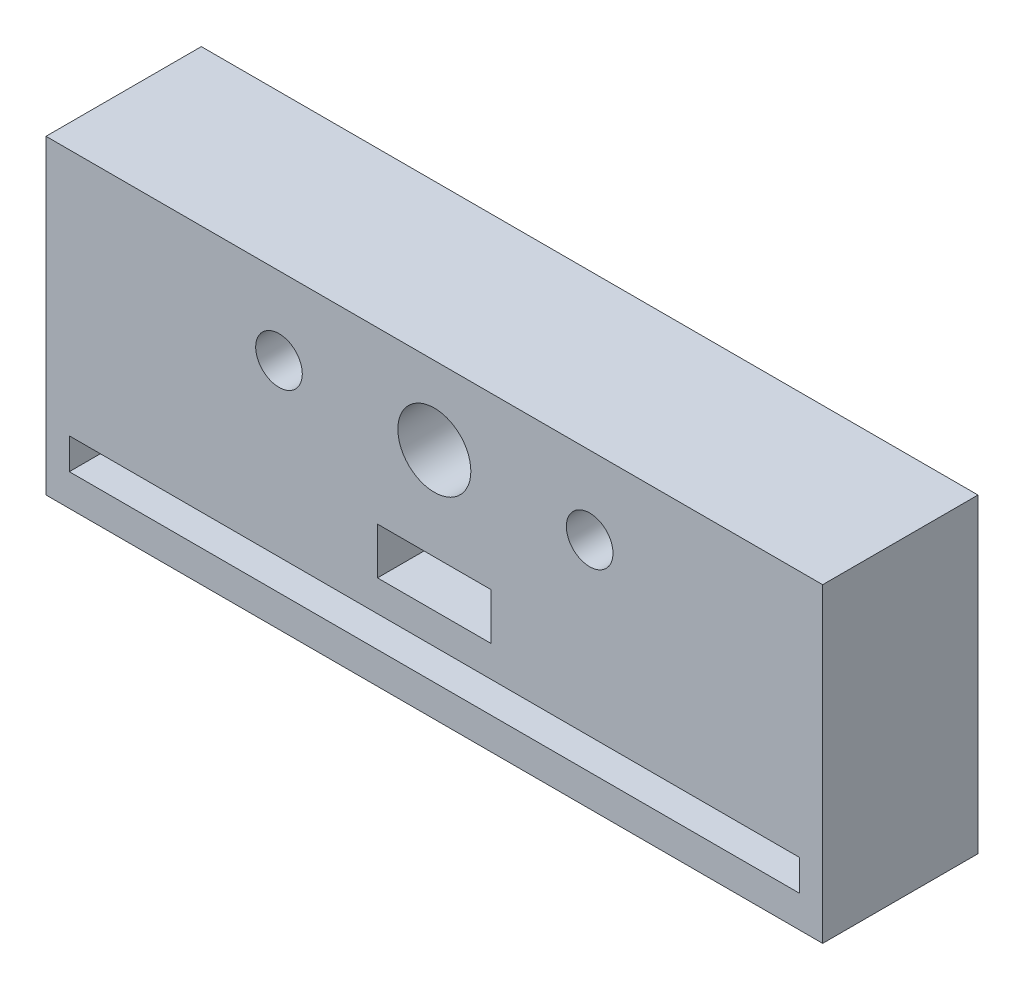
ISO-10303-21;
HEADER;
FILE_DESCRIPTION(('STEP AP214'),'2;1');
FILE_NAME('part.step','',(''),(''),'','','');
FILE_SCHEMA(('AUTOMOTIVE_DESIGN { 1 0 10303 214 1 1 1 1 }'));
ENDSEC;
DATA;
#1=APPLICATION_CONTEXT('core data for automotive mechanical design processes');
#2=APPLICATION_PROTOCOL_DEFINITION('international standard','automotive_design',2000,#1);
#3=PRODUCT_CONTEXT('',#1,'mechanical');
#4=PRODUCT('Part','Part','',(#3));
#5=PRODUCT_RELATED_PRODUCT_CATEGORY('part','',(#4));
#6=PRODUCT_DEFINITION_FORMATION('','',#4);
#7=PRODUCT_DEFINITION_CONTEXT('part definition',#1,'design');
#8=PRODUCT_DEFINITION('design','',#6,#7);
#9=PRODUCT_DEFINITION_SHAPE('','',#8);
#10=(LENGTH_UNIT() NAMED_UNIT(*) SI_UNIT(.MILLI.,.METRE.));
#11=(NAMED_UNIT(*) PLANE_ANGLE_UNIT() SI_UNIT($,.RADIAN.));
#12=(NAMED_UNIT(*) SI_UNIT($,.STERADIAN.) SOLID_ANGLE_UNIT());
#13=UNCERTAINTY_MEASURE_WITH_UNIT(LENGTH_MEASURE(1.E-05),#10,'distance_accuracy_value','');
#14=(GEOMETRIC_REPRESENTATION_CONTEXT(3) GLOBAL_UNCERTAINTY_ASSIGNED_CONTEXT((#13)) GLOBAL_UNIT_ASSIGNED_CONTEXT((#10,
#11,#12)) REPRESENTATION_CONTEXT('',''));
#15=CARTESIAN_POINT('',(0.,0.,0.));
#16=DIRECTION('',(0.,0.,1.));
#17=DIRECTION('',(1.,0.,0.));
#18=AXIS2_PLACEMENT_3D('',#15,#16,#17);
#19=CARTESIAN_POINT('',(0.,0.,10.));
#20=DIRECTION('',(0.,0.,-1.));
#21=DIRECTION('',(-1.,0.,0.));
#22=AXIS2_PLACEMENT_3D('',#19,#20,#21);
#23=PLANE('',#22);
#24=CARTESIAN_POINT('',(10.,7.45071428571426,10.));
#25=DIRECTION('',(0.,0.,1.));
#26=DIRECTION('',(1.,0.,0.));
#27=AXIS2_PLACEMENT_3D('',#24,#25,#26);
#28=CIRCLE('',#27,1.5);
#29=CARTESIAN_POINT('',(11.5,7.45071428571426,10.));
#30=VERTEX_POINT('',#29);
#31=EDGE_CURVE('E161',#30,#30,#28,.T.);
#32=ORIENTED_EDGE('',*,*,#31,.F.);
#33=EDGE_LOOP('',(#32));
#34=FACE_BOUND('',#33,.T.);
#35=CARTESIAN_POINT('',(-10.,7.45071428571426,10.));
#36=DIRECTION('',(0.,0.,1.));
#37=DIRECTION('',(1.,0.,0.));
#38=AXIS2_PLACEMENT_3D('',#35,#36,#37);
#39=CIRCLE('',#38,1.5);
#40=CARTESIAN_POINT('',(-8.5,7.45071428571426,10.));
#41=VERTEX_POINT('',#40);
#42=EDGE_CURVE('E167',#41,#41,#39,.T.);
#43=ORIENTED_EDGE('',*,*,#42,.F.);
#44=EDGE_LOOP('',(#43));
#45=FACE_BOUND('',#44,.T.);
#46=DIRECTION('',(0.,1.,0.));
#47=VECTOR('',#46,1.);
#48=CARTESIAN_POINT('',(3.66,1.5,10.));
#49=LINE('',#48,#47);
#50=CARTESIAN_POINT('',(3.66,-1.5,10.));
#51=VERTEX_POINT('',#50);
#52=CARTESIAN_POINT('',(3.66,1.5,10.));
#53=VERTEX_POINT('',#52);
#54=EDGE_CURVE('E173',#51,#53,#49,.T.);
#55=ORIENTED_EDGE('',*,*,#54,.F.);
#56=DIRECTION('',(1.,0.,0.));
#57=VECTOR('',#56,1.);
#58=CARTESIAN_POINT('',(-3.66,-1.5,10.));
#59=LINE('',#58,#57);
#60=CARTESIAN_POINT('',(-3.66,-1.5,10.));
#61=VERTEX_POINT('',#60);
#62=EDGE_CURVE('E181',#61,#51,#59,.T.);
#63=ORIENTED_EDGE('',*,*,#62,.F.);
#64=DIRECTION('',(0.,-1.,0.));
#65=VECTOR('',#64,1.);
#66=CARTESIAN_POINT('',(-3.66,1.5,10.));
#67=LINE('',#66,#65);
#68=CARTESIAN_POINT('',(-3.66,1.5,10.));
#69=VERTEX_POINT('',#68);
#70=EDGE_CURVE('E178',#69,#61,#67,.T.);
#71=ORIENTED_EDGE('',*,*,#70,.F.);
#72=DIRECTION('',(-1.,0.,0.));
#73=VECTOR('',#72,1.);
#74=CARTESIAN_POINT('',(-3.66,1.5,10.));
#75=LINE('',#74,#73);
#76=EDGE_CURVE('E175',#53,#69,#75,.T.);
#77=ORIENTED_EDGE('',*,*,#76,.F.);
#78=EDGE_LOOP('',(#55,#63,#71,#77));
#79=FACE_BOUND('',#78,.T.);
#80=DIRECTION('',(0.,-1.,0.));
#81=VECTOR('',#80,1.);
#82=CARTESIAN_POINT('',(-25.,-7.54928571428574,10.));
#83=LINE('',#82,#81);
#84=CARTESIAN_POINT('',(-25.,12.4507142857143,10.));
#85=VERTEX_POINT('',#84);
#86=CARTESIAN_POINT('',(-25.,-7.54928571428574,10.));
#87=VERTEX_POINT('',#86);
#88=EDGE_CURVE('E204',#85,#87,#83,.T.);
#89=ORIENTED_EDGE('',*,*,#88,.T.);
#90=DIRECTION('',(1.,0.,0.));
#91=VECTOR('',#90,1.);
#92=CARTESIAN_POINT('',(-25.,-7.54928571428574,10.));
#93=LINE('',#92,#91);
#94=CARTESIAN_POINT('',(25.,-7.54928571428574,10.));
#95=VERTEX_POINT('',#94);
#96=EDGE_CURVE('E207',#87,#95,#93,.T.);
#97=ORIENTED_EDGE('',*,*,#96,.T.);
#98=DIRECTION('',(0.,1.,0.));
#99=VECTOR('',#98,1.);
#100=CARTESIAN_POINT('',(25.,-7.54928571428574,10.));
#101=LINE('',#100,#99);
#102=CARTESIAN_POINT('',(25.,12.4507142857143,10.));
#103=VERTEX_POINT('',#102);
#104=EDGE_CURVE('E210',#95,#103,#101,.T.);
#105=ORIENTED_EDGE('',*,*,#104,.T.);
#106=DIRECTION('',(-1.,0.,0.));
#107=VECTOR('',#106,1.);
#108=CARTESIAN_POINT('',(-25.,12.4507142857143,10.));
#109=LINE('',#108,#107);
#110=EDGE_CURVE('E212',#103,#85,#109,.T.);
#111=ORIENTED_EDGE('',*,*,#110,.T.);
#112=EDGE_LOOP('',(#89,#97,#105,#111));
#113=FACE_BOUND('',#112,.T.);
#114=DIRECTION('',(0.,-1.,0.));
#115=VECTOR('',#114,1.);
#116=CARTESIAN_POINT('',(-23.5,-3.5,10.));
#117=LINE('',#116,#115);
#118=CARTESIAN_POINT('',(-23.5,-3.5,10.));
#119=VERTEX_POINT('',#118);
#120=CARTESIAN_POINT('',(-23.5,-5.5,10.));
#121=VERTEX_POINT('',#120);
#122=EDGE_CURVE('E122',#119,#121,#117,.T.);
#123=ORIENTED_EDGE('',*,*,#122,.F.);
#124=DIRECTION('',(-1.,0.,0.));
#125=VECTOR('',#124,1.);
#126=CARTESIAN_POINT('',(-23.5,-3.5,10.));
#127=LINE('',#126,#125);
#128=CARTESIAN_POINT('',(23.5,-3.5,10.));
#129=VERTEX_POINT('',#128);
#130=EDGE_CURVE('E145',#129,#119,#127,.T.);
#131=ORIENTED_EDGE('',*,*,#130,.F.);
#132=DIRECTION('',(0.,1.,0.));
#133=VECTOR('',#132,1.);
#134=CARTESIAN_POINT('',(23.5,-3.5,10.));
#135=LINE('',#134,#133);
#136=CARTESIAN_POINT('',(23.5,-5.5,10.));
#137=VERTEX_POINT('',#136);
#138=EDGE_CURVE('E143',#137,#129,#135,.T.);
#139=ORIENTED_EDGE('',*,*,#138,.F.);
#140=DIRECTION('',(1.,0.,0.));
#141=VECTOR('',#140,1.);
#142=CARTESIAN_POINT('',(-23.5,-5.5,10.));
#143=LINE('',#142,#141);
#144=EDGE_CURVE('E130',#121,#137,#143,.T.);
#145=ORIENTED_EDGE('',*,*,#144,.F.);
#146=EDGE_LOOP('',(#123,#131,#139,#145));
#147=FACE_BOUND('',#146,.T.);
#148=CARTESIAN_POINT('',(0.,7.45071428571426,10.));
#149=DIRECTION('',(0.,0.,1.));
#150=DIRECTION('',(1.,0.,0.));
#151=AXIS2_PLACEMENT_3D('',#148,#149,#150);
#152=CIRCLE('',#151,2.35);
#153=CARTESIAN_POINT('',(2.35,7.45071428571426,10.));
#154=VERTEX_POINT('',#153);
#155=EDGE_CURVE('E151',#154,#154,#152,.T.);
#156=ORIENTED_EDGE('',*,*,#155,.F.);
#157=EDGE_LOOP('',(#156));
#158=FACE_BOUND('',#157,.T.);
#159=ADVANCED_FACE('F33',(#34,#45,#79,#113,#147,#158),#23,.F.);
#160=CARTESIAN_POINT('',(0.,0.,0.));
#161=DIRECTION('',(0.,0.,-1.));
#162=DIRECTION('',(-1.,0.,0.));
#163=AXIS2_PLACEMENT_3D('',#160,#161,#162);
#164=PLANE('',#163);
#165=DIRECTION('',(-1.,0.,0.));
#166=VECTOR('',#165,1.);
#167=CARTESIAN_POINT('',(-23.5,-3.5,0.));
#168=LINE('',#167,#166);
#169=CARTESIAN_POINT('',(23.5,-3.5,0.));
#170=VERTEX_POINT('',#169);
#171=CARTESIAN_POINT('',(-23.5,-3.5,0.));
#172=VERTEX_POINT('',#171);
#173=EDGE_CURVE('E131',#170,#172,#168,.T.);
#174=ORIENTED_EDGE('',*,*,#173,.T.);
#175=DIRECTION('',(0.,-1.,0.));
#176=VECTOR('',#175,1.);
#177=CARTESIAN_POINT('',(-23.5,-3.5,0.));
#178=LINE('',#177,#176);
#179=CARTESIAN_POINT('',(-23.5,-5.5,0.));
#180=VERTEX_POINT('',#179);
#181=EDGE_CURVE('E56',#172,#180,#178,.T.);
#182=ORIENTED_EDGE('',*,*,#181,.T.);
#183=DIRECTION('',(1.,0.,0.));
#184=VECTOR('',#183,1.);
#185=CARTESIAN_POINT('',(-23.5,-5.5,0.));
#186=LINE('',#185,#184);
#187=CARTESIAN_POINT('',(23.5,-5.5,0.));
#188=VERTEX_POINT('',#187);
#189=EDGE_CURVE('E137',#180,#188,#186,.T.);
#190=ORIENTED_EDGE('',*,*,#189,.T.);
#191=DIRECTION('',(0.,1.,0.));
#192=VECTOR('',#191,1.);
#193=CARTESIAN_POINT('',(23.5,-3.5,0.));
#194=LINE('',#193,#192);
#195=EDGE_CURVE('E153',#188,#170,#194,.T.);
#196=ORIENTED_EDGE('',*,*,#195,.T.);
#197=EDGE_LOOP('',(#174,#182,#190,#196));
#198=FACE_BOUND('',#197,.T.);
#199=CARTESIAN_POINT('',(10.,7.45071428571426,0.));
#200=DIRECTION('',(0.,0.,1.));
#201=DIRECTION('',(1.,0.,0.));
#202=AXIS2_PLACEMENT_3D('',#199,#200,#201);
#203=CIRCLE('',#202,1.5);
#204=CARTESIAN_POINT('',(11.5,7.45071428571426,0.));
#205=VERTEX_POINT('',#204);
#206=EDGE_CURVE('E138',#205,#205,#203,.T.);
#207=ORIENTED_EDGE('',*,*,#206,.T.);
#208=EDGE_LOOP('',(#207));
#209=FACE_BOUND('',#208,.T.);
#210=DIRECTION('',(1.,0.,0.));
#211=VECTOR('',#210,1.);
#212=CARTESIAN_POINT('',(-3.66,-1.5,0.));
#213=LINE('',#212,#211);
#214=CARTESIAN_POINT('',(-3.66,-1.5,0.));
#215=VERTEX_POINT('',#214);
#216=CARTESIAN_POINT('',(3.66,-1.5,0.));
#217=VERTEX_POINT('',#216);
#218=EDGE_CURVE('E176',#215,#217,#213,.T.);
#219=ORIENTED_EDGE('',*,*,#218,.T.);
#220=DIRECTION('',(0.,1.,0.));
#221=VECTOR('',#220,1.);
#222=CARTESIAN_POINT('',(3.66,1.5,0.));
#223=LINE('',#222,#221);
#224=CARTESIAN_POINT('',(3.66,1.5,0.));
#225=VERTEX_POINT('',#224);
#226=EDGE_CURVE('E170',#217,#225,#223,.T.);
#227=ORIENTED_EDGE('',*,*,#226,.T.);
#228=DIRECTION('',(-1.,0.,0.));
#229=VECTOR('',#228,1.);
#230=CARTESIAN_POINT('',(-3.66,1.5,0.));
#231=LINE('',#230,#229);
#232=CARTESIAN_POINT('',(-3.66,1.5,0.));
#233=VERTEX_POINT('',#232);
#234=EDGE_CURVE('E186',#225,#233,#231,.T.);
#235=ORIENTED_EDGE('',*,*,#234,.T.);
#236=DIRECTION('',(0.,-1.,0.));
#237=VECTOR('',#236,1.);
#238=CARTESIAN_POINT('',(-3.66,1.5,0.));
#239=LINE('',#238,#237);
#240=EDGE_CURVE('E189',#233,#215,#239,.T.);
#241=ORIENTED_EDGE('',*,*,#240,.T.);
#242=EDGE_LOOP('',(#219,#227,#235,#241));
#243=FACE_BOUND('',#242,.T.);
#244=DIRECTION('',(0.,-1.,0.));
#245=VECTOR('',#244,1.);
#246=CARTESIAN_POINT('',(-25.,-7.54928571428574,0.));
#247=LINE('',#246,#245);
#248=CARTESIAN_POINT('',(-25.,12.4507142857143,0.));
#249=VERTEX_POINT('',#248);
#250=CARTESIAN_POINT('',(-25.,-7.54928571428574,0.));
#251=VERTEX_POINT('',#250);
#252=EDGE_CURVE('E203',#249,#251,#247,.T.);
#253=ORIENTED_EDGE('',*,*,#252,.F.);
#254=DIRECTION('',(-1.,0.,0.));
#255=VECTOR('',#254,1.);
#256=CARTESIAN_POINT('',(-25.,12.4507142857143,0.));
#257=LINE('',#256,#255);
#258=CARTESIAN_POINT('',(25.,12.4507142857143,0.));
#259=VERTEX_POINT('',#258);
#260=EDGE_CURVE('E208',#259,#249,#257,.T.);
#261=ORIENTED_EDGE('',*,*,#260,.F.);
#262=DIRECTION('',(0.,1.,0.));
#263=VECTOR('',#262,1.);
#264=CARTESIAN_POINT('',(25.,-7.54928571428574,0.));
#265=LINE('',#264,#263);
#266=CARTESIAN_POINT('',(25.,-7.54928571428574,0.));
#267=VERTEX_POINT('',#266);
#268=EDGE_CURVE('E219',#267,#259,#265,.T.);
#269=ORIENTED_EDGE('',*,*,#268,.F.);
#270=DIRECTION('',(1.,0.,0.));
#271=VECTOR('',#270,1.);
#272=CARTESIAN_POINT('',(-25.,-7.54928571428574,0.));
#273=LINE('',#272,#271);
#274=EDGE_CURVE('E217',#251,#267,#273,.T.);
#275=ORIENTED_EDGE('',*,*,#274,.F.);
#276=EDGE_LOOP('',(#253,#261,#269,#275));
#277=FACE_BOUND('',#276,.T.);
#278=CARTESIAN_POINT('',(-10.,7.45071428571426,0.));
#279=DIRECTION('',(0.,0.,1.));
#280=DIRECTION('',(1.,0.,0.));
#281=AXIS2_PLACEMENT_3D('',#278,#279,#280);
#282=CIRCLE('',#281,1.5);
#283=CARTESIAN_POINT('',(-8.5,7.45071428571426,0.));
#284=VERTEX_POINT('',#283);
#285=EDGE_CURVE('E164',#284,#284,#282,.T.);
#286=ORIENTED_EDGE('',*,*,#285,.T.);
#287=EDGE_LOOP('',(#286));
#288=FACE_BOUND('',#287,.T.);
#289=CARTESIAN_POINT('',(0.,7.45071428571426,0.));
#290=DIRECTION('',(0.,0.,1.));
#291=DIRECTION('',(1.,0.,0.));
#292=AXIS2_PLACEMENT_3D('',#289,#290,#291);
#293=CIRCLE('',#292,2.35);
#294=CARTESIAN_POINT('',(2.35,7.45071428571426,0.));
#295=VERTEX_POINT('',#294);
#296=EDGE_CURVE('E329',#295,#295,#293,.T.);
#297=ORIENTED_EDGE('',*,*,#296,.T.);
#298=EDGE_LOOP('',(#297));
#299=FACE_BOUND('',#298,.T.);
#300=ADVANCED_FACE('F237',(#198,#209,#243,#277,#288,#299),#164,.T.);
#301=CARTESIAN_POINT('',(-25.,-7.54928571428574,10.));
#302=DIRECTION('',(1.,0.,0.));
#303=DIRECTION('',(0.,0.,-1.));
#304=AXIS2_PLACEMENT_3D('',#301,#302,#303);
#305=PLANE('',#304);
#306=ORIENTED_EDGE('',*,*,#252,.T.);
#307=DIRECTION('',(0.,0.,-1.));
#308=VECTOR('',#307,1.);
#309=CARTESIAN_POINT('',(-25.,-7.54928571428574,10.));
#310=LINE('',#309,#308);
#311=EDGE_CURVE('E11',#87,#251,#310,.T.);
#312=ORIENTED_EDGE('',*,*,#311,.F.);
#313=ORIENTED_EDGE('',*,*,#88,.F.);
#314=DIRECTION('',(0.,0.,-1.));
#315=VECTOR('',#314,1.);
#316=CARTESIAN_POINT('',(-25.,12.4507142857143,10.));
#317=LINE('',#316,#315);
#318=EDGE_CURVE('E214',#85,#249,#317,.T.);
#319=ORIENTED_EDGE('',*,*,#318,.T.);
#320=EDGE_LOOP('',(#306,#312,#313,#319));
#321=FACE_BOUND('',#320,.T.);
#322=ADVANCED_FACE('F35',(#321),#305,.F.);
#323=CARTESIAN_POINT('',(-25.,-7.54928571428574,10.));
#324=DIRECTION('',(0.,1.,0.));
#325=DIRECTION('',(0.,0.,1.));
#326=AXIS2_PLACEMENT_3D('',#323,#324,#325);
#327=PLANE('',#326);
#328=ORIENTED_EDGE('',*,*,#274,.T.);
#329=DIRECTION('',(0.,0.,-1.));
#330=VECTOR('',#329,1.);
#331=CARTESIAN_POINT('',(25.,-7.54928571428574,10.));
#332=LINE('',#331,#330);
#333=EDGE_CURVE('E41',#95,#267,#332,.T.);
#334=ORIENTED_EDGE('',*,*,#333,.F.);
#335=ORIENTED_EDGE('',*,*,#96,.F.);
#336=ORIENTED_EDGE('',*,*,#311,.T.);
#337=EDGE_LOOP('',(#328,#334,#335,#336));
#338=FACE_BOUND('',#337,.T.);
#339=ADVANCED_FACE('F247',(#338),#327,.F.);
#340=CARTESIAN_POINT('',(25.,-7.54928571428574,10.));
#341=DIRECTION('',(-1.,0.,0.));
#342=DIRECTION('',(0.,0.,1.));
#343=AXIS2_PLACEMENT_3D('',#340,#341,#342);
#344=PLANE('',#343);
#345=ORIENTED_EDGE('',*,*,#268,.T.);
#346=DIRECTION('',(0.,0.,-1.));
#347=VECTOR('',#346,1.);
#348=CARTESIAN_POINT('',(25.,12.4507142857143,10.));
#349=LINE('',#348,#347);
#350=EDGE_CURVE('E224',#103,#259,#349,.T.);
#351=ORIENTED_EDGE('',*,*,#350,.F.);
#352=ORIENTED_EDGE('',*,*,#104,.F.);
#353=ORIENTED_EDGE('',*,*,#333,.T.);
#354=EDGE_LOOP('',(#345,#351,#352,#353));
#355=FACE_BOUND('',#354,.T.);
#356=ADVANCED_FACE('F231',(#355),#344,.F.);
#357=CARTESIAN_POINT('',(-25.,12.4507142857143,10.));
#358=DIRECTION('',(0.,-1.,0.));
#359=DIRECTION('',(0.,0.,-1.));
#360=AXIS2_PLACEMENT_3D('',#357,#358,#359);
#361=PLANE('',#360);
#362=ORIENTED_EDGE('',*,*,#260,.T.);
#363=ORIENTED_EDGE('',*,*,#318,.F.);
#364=ORIENTED_EDGE('',*,*,#110,.F.);
#365=ORIENTED_EDGE('',*,*,#350,.T.);
#366=EDGE_LOOP('',(#362,#363,#364,#365));
#367=FACE_BOUND('',#366,.T.);
#368=ADVANCED_FACE('F241',(#367),#361,.F.);
#369=CARTESIAN_POINT('',(3.66,1.5,10.));
#370=DIRECTION('',(-1.,0.,0.));
#371=DIRECTION('',(0.,-1.,0.));
#372=AXIS2_PLACEMENT_3D('',#369,#370,#371);
#373=PLANE('',#372);
#374=ORIENTED_EDGE('',*,*,#226,.F.);
#375=DIRECTION('',(0.,0.,-1.));
#376=VECTOR('',#375,1.);
#377=CARTESIAN_POINT('',(3.66,-1.5,10.));
#378=LINE('',#377,#376);
#379=EDGE_CURVE('E183',#51,#217,#378,.T.);
#380=ORIENTED_EDGE('',*,*,#379,.F.);
#381=ORIENTED_EDGE('',*,*,#54,.T.);
#382=DIRECTION('',(0.,0.,-1.));
#383=VECTOR('',#382,1.);
#384=CARTESIAN_POINT('',(3.66,1.5,10.));
#385=LINE('',#384,#383);
#386=EDGE_CURVE('E200',#53,#225,#385,.T.);
#387=ORIENTED_EDGE('',*,*,#386,.T.);
#388=EDGE_LOOP('',(#374,#380,#381,#387));
#389=FACE_BOUND('',#388,.T.);
#390=ADVANCED_FACE('F265',(#389),#373,.T.);
#391=CARTESIAN_POINT('',(-3.66,1.5,10.));
#392=DIRECTION('',(0.,-1.,0.));
#393=DIRECTION('',(0.,0.,-1.));
#394=AXIS2_PLACEMENT_3D('',#391,#392,#393);
#395=PLANE('',#394);
#396=ORIENTED_EDGE('',*,*,#234,.F.);
#397=ORIENTED_EDGE('',*,*,#386,.F.);
#398=ORIENTED_EDGE('',*,*,#76,.T.);
#399=DIRECTION('',(0.,0.,-1.));
#400=VECTOR('',#399,1.);
#401=CARTESIAN_POINT('',(-3.66,1.5,10.));
#402=LINE('',#401,#400);
#403=EDGE_CURVE('E198',#69,#233,#402,.T.);
#404=ORIENTED_EDGE('',*,*,#403,.T.);
#405=EDGE_LOOP('',(#396,#397,#398,#404));
#406=FACE_BOUND('',#405,.T.);
#407=ADVANCED_FACE('F272',(#406),#395,.T.);
#408=CARTESIAN_POINT('',(-3.66,1.5,10.));
#409=DIRECTION('',(1.,0.,0.));
#410=DIRECTION('',(0.,1.,0.));
#411=AXIS2_PLACEMENT_3D('',#408,#409,#410);
#412=PLANE('',#411);
#413=ORIENTED_EDGE('',*,*,#240,.F.);
#414=ORIENTED_EDGE('',*,*,#403,.F.);
#415=ORIENTED_EDGE('',*,*,#70,.T.);
#416=DIRECTION('',(0.,0.,-1.));
#417=VECTOR('',#416,1.);
#418=CARTESIAN_POINT('',(-3.66,-1.5,10.));
#419=LINE('',#418,#417);
#420=EDGE_CURVE('E196',#61,#215,#419,.T.);
#421=ORIENTED_EDGE('',*,*,#420,.T.);
#422=EDGE_LOOP('',(#413,#414,#415,#421));
#423=FACE_BOUND('',#422,.T.);
#424=ADVANCED_FACE('F277',(#423),#412,.T.);
#425=CARTESIAN_POINT('',(-3.66,-1.5,10.));
#426=DIRECTION('',(0.,1.,0.));
#427=DIRECTION('',(0.,0.,1.));
#428=AXIS2_PLACEMENT_3D('',#425,#426,#427);
#429=PLANE('',#428);
#430=ORIENTED_EDGE('',*,*,#218,.F.);
#431=ORIENTED_EDGE('',*,*,#420,.F.);
#432=ORIENTED_EDGE('',*,*,#62,.T.);
#433=ORIENTED_EDGE('',*,*,#379,.T.);
#434=EDGE_LOOP('',(#430,#431,#432,#433));
#435=FACE_BOUND('',#434,.T.);
#436=ADVANCED_FACE('F285',(#435),#429,.T.);
#437=CARTESIAN_POINT('',(-10.,7.45071428571426,10.));
#438=DIRECTION('',(0.,0.,-1.));
#439=DIRECTION('',(-1.,0.,0.));
#440=AXIS2_PLACEMENT_3D('',#437,#438,#439);
#441=CYLINDRICAL_SURFACE('',#440,1.5);
#442=ORIENTED_EDGE('',*,*,#42,.T.);
#443=EDGE_LOOP('',(#442));
#444=FACE_BOUND('',#443,.T.);
#445=ORIENTED_EDGE('',*,*,#285,.F.);
#446=EDGE_LOOP('',(#445));
#447=FACE_BOUND('',#446,.T.);
#448=ADVANCED_FACE('F298',(#444,#447),#441,.F.);
#449=CARTESIAN_POINT('',(10.,7.45071428571426,10.));
#450=DIRECTION('',(0.,0.,-1.));
#451=DIRECTION('',(-1.,0.,0.));
#452=AXIS2_PLACEMENT_3D('',#449,#450,#451);
#453=CYLINDRICAL_SURFACE('',#452,1.5);
#454=ORIENTED_EDGE('',*,*,#31,.T.);
#455=EDGE_LOOP('',(#454));
#456=FACE_BOUND('',#455,.T.);
#457=ORIENTED_EDGE('',*,*,#206,.F.);
#458=EDGE_LOOP('',(#457));
#459=FACE_BOUND('',#458,.T.);
#460=ADVANCED_FACE('F303',(#456,#459),#453,.F.);
#461=CARTESIAN_POINT('',(-23.5,-3.5,10.));
#462=DIRECTION('',(1.,0.,0.));
#463=DIRECTION('',(0.,0.,-1.));
#464=AXIS2_PLACEMENT_3D('',#461,#462,#463);
#465=PLANE('',#464);
#466=ORIENTED_EDGE('',*,*,#181,.F.);
#467=DIRECTION('',(0.,0.,-1.));
#468=VECTOR('',#467,1.);
#469=CARTESIAN_POINT('',(-23.5,-3.5,10.));
#470=LINE('',#469,#468);
#471=EDGE_CURVE('E126',#119,#172,#470,.T.);
#472=ORIENTED_EDGE('',*,*,#471,.F.);
#473=ORIENTED_EDGE('',*,*,#122,.T.);
#474=DIRECTION('',(0.,0.,-1.));
#475=VECTOR('',#474,1.);
#476=CARTESIAN_POINT('',(-23.5,-5.5,10.));
#477=LINE('',#476,#475);
#478=EDGE_CURVE('E125',#121,#180,#477,.T.);
#479=ORIENTED_EDGE('',*,*,#478,.T.);
#480=EDGE_LOOP('',(#466,#472,#473,#479));
#481=FACE_BOUND('',#480,.T.);
#482=ADVANCED_FACE('F124',(#481),#465,.T.);
#483=CARTESIAN_POINT('',(-23.5,-5.5,10.));
#484=DIRECTION('',(0.,1.,0.));
#485=DIRECTION('',(0.,0.,1.));
#486=AXIS2_PLACEMENT_3D('',#483,#484,#485);
#487=PLANE('',#486);
#488=ORIENTED_EDGE('',*,*,#189,.F.);
#489=ORIENTED_EDGE('',*,*,#478,.F.);
#490=ORIENTED_EDGE('',*,*,#144,.T.);
#491=DIRECTION('',(0.,0.,-1.));
#492=VECTOR('',#491,1.);
#493=CARTESIAN_POINT('',(23.5,-5.5,10.));
#494=LINE('',#493,#492);
#495=EDGE_CURVE('E139',#137,#188,#494,.T.);
#496=ORIENTED_EDGE('',*,*,#495,.T.);
#497=EDGE_LOOP('',(#488,#489,#490,#496));
#498=FACE_BOUND('',#497,.T.);
#499=ADVANCED_FACE('F134',(#498),#487,.T.);
#500=CARTESIAN_POINT('',(23.5,-3.5,10.));
#501=DIRECTION('',(-1.,0.,0.));
#502=DIRECTION('',(0.,0.,1.));
#503=AXIS2_PLACEMENT_3D('',#500,#501,#502);
#504=PLANE('',#503);
#505=ORIENTED_EDGE('',*,*,#195,.F.);
#506=ORIENTED_EDGE('',*,*,#495,.F.);
#507=ORIENTED_EDGE('',*,*,#138,.T.);
#508=DIRECTION('',(0.,0.,-1.));
#509=VECTOR('',#508,1.);
#510=CARTESIAN_POINT('',(23.5,-3.5,10.));
#511=LINE('',#510,#509);
#512=EDGE_CURVE('E48',#129,#170,#511,.T.);
#513=ORIENTED_EDGE('',*,*,#512,.T.);
#514=EDGE_LOOP('',(#505,#506,#507,#513));
#515=FACE_BOUND('',#514,.T.);
#516=ADVANCED_FACE('F312',(#515),#504,.T.);
#517=CARTESIAN_POINT('',(-23.5,-3.5,10.));
#518=DIRECTION('',(0.,-1.,0.));
#519=DIRECTION('',(0.,0.,-1.));
#520=AXIS2_PLACEMENT_3D('',#517,#518,#519);
#521=PLANE('',#520);
#522=ORIENTED_EDGE('',*,*,#173,.F.);
#523=ORIENTED_EDGE('',*,*,#512,.F.);
#524=ORIENTED_EDGE('',*,*,#130,.T.);
#525=ORIENTED_EDGE('',*,*,#471,.T.);
#526=EDGE_LOOP('',(#522,#523,#524,#525));
#527=FACE_BOUND('',#526,.T.);
#528=ADVANCED_FACE('F315',(#527),#521,.T.);
#529=CARTESIAN_POINT('',(0.,7.45071428571426,10.));
#530=DIRECTION('',(0.,0.,-1.));
#531=DIRECTION('',(-1.,0.,0.));
#532=AXIS2_PLACEMENT_3D('',#529,#530,#531);
#533=CYLINDRICAL_SURFACE('',#532,2.35);
#534=ORIENTED_EDGE('',*,*,#155,.T.);
#535=EDGE_LOOP('',(#534));
#536=FACE_BOUND('',#535,.T.);
#537=ORIENTED_EDGE('',*,*,#296,.F.);
#538=EDGE_LOOP('',(#537));
#539=FACE_BOUND('',#538,.T.);
#540=ADVANCED_FACE('F319',(#536,#539),#533,.F.);
#541=CLOSED_SHELL('',(#159,#300,#322,#339,#356,#368,#390,#407,#424,#436,#448,#460,#482,#499,
#516,#528,#540));
#542=MANIFOLD_SOLID_BREP('B2',#541);
#543=ADVANCED_BREP_SHAPE_REPRESENTATION('',(#18,#542),#14);
#544=SHAPE_DEFINITION_REPRESENTATION(#9,#543);
ENDSEC;
END-ISO-10303-21;
